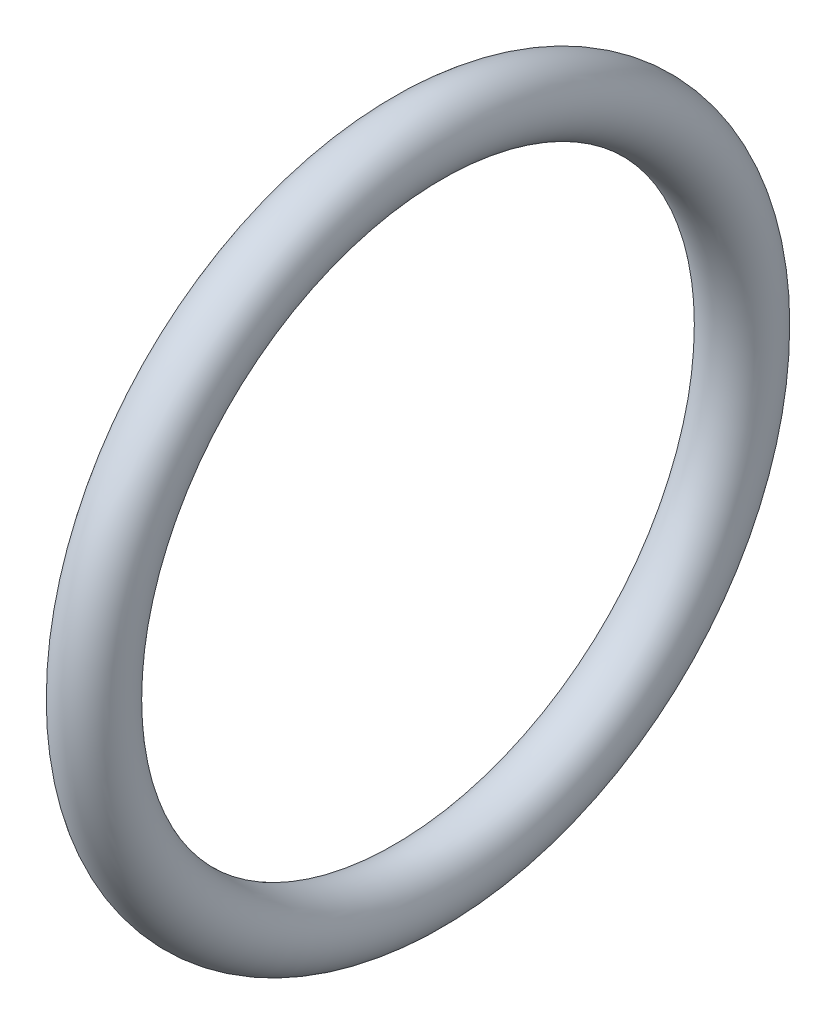
ISO-10303-21;
HEADER;
FILE_DESCRIPTION(('STEP AP214'),'2;1');
FILE_NAME('part.step','',(''),(''),'','','');
FILE_SCHEMA(('AUTOMOTIVE_DESIGN { 1 0 10303 214 1 1 1 1 }'));
ENDSEC;
DATA;
#1=APPLICATION_CONTEXT('core data for automotive mechanical design processes');
#2=APPLICATION_PROTOCOL_DEFINITION('international standard','automotive_design',2000,#1);
#3=PRODUCT_CONTEXT('',#1,'mechanical');
#4=PRODUCT('Part','Part','',(#3));
#5=PRODUCT_RELATED_PRODUCT_CATEGORY('part','',(#4));
#6=PRODUCT_DEFINITION_FORMATION('','',#4);
#7=PRODUCT_DEFINITION_CONTEXT('part definition',#1,'design');
#8=PRODUCT_DEFINITION('design','',#6,#7);
#9=PRODUCT_DEFINITION_SHAPE('','',#8);
#10=(LENGTH_UNIT() NAMED_UNIT(*) SI_UNIT(.MILLI.,.METRE.));
#11=(NAMED_UNIT(*) PLANE_ANGLE_UNIT() SI_UNIT($,.RADIAN.));
#12=(NAMED_UNIT(*) SI_UNIT($,.STERADIAN.) SOLID_ANGLE_UNIT());
#13=UNCERTAINTY_MEASURE_WITH_UNIT(LENGTH_MEASURE(1.E-05),#10,'distance_accuracy_value','');
#14=(GEOMETRIC_REPRESENTATION_CONTEXT(3) GLOBAL_UNCERTAINTY_ASSIGNED_CONTEXT((#13)) GLOBAL_UNIT_ASSIGNED_CONTEXT((#10,
#11,#12)) REPRESENTATION_CONTEXT('',''));
#15=CARTESIAN_POINT('',(0.,0.,0.));
#16=DIRECTION('',(0.,0.,1.));
#17=DIRECTION('',(1.,0.,0.));
#18=AXIS2_PLACEMENT_3D('',#15,#16,#17);
#19=CARTESIAN_POINT('',(0.,0.,0.));
#20=DIRECTION('',(1.,0.,0.));
#21=DIRECTION('',(0.,0.,-1.));
#22=AXIS2_PLACEMENT_3D('',#19,#20,#21);
#23=TOROIDAL_SURFACE('',#22,24.,2.5);
#24=CARTESIAN_POINT('',(0.,0.,-26.5));
#25=VERTEX_POINT('',#24);
#26=VERTEX_LOOP('',#25);
#27=FACE_BOUND('',#26,.T.);
#28=ADVANCED_FACE('F26',(#27),#23,.T.);
#29=CLOSED_SHELL('',(#28));
#30=MANIFOLD_SOLID_BREP('B2',#29);
#31=ADVANCED_BREP_SHAPE_REPRESENTATION('',(#18,#30),#14);
#32=SHAPE_DEFINITION_REPRESENTATION(#9,#31);
ENDSEC;
END-ISO-10303-21;
